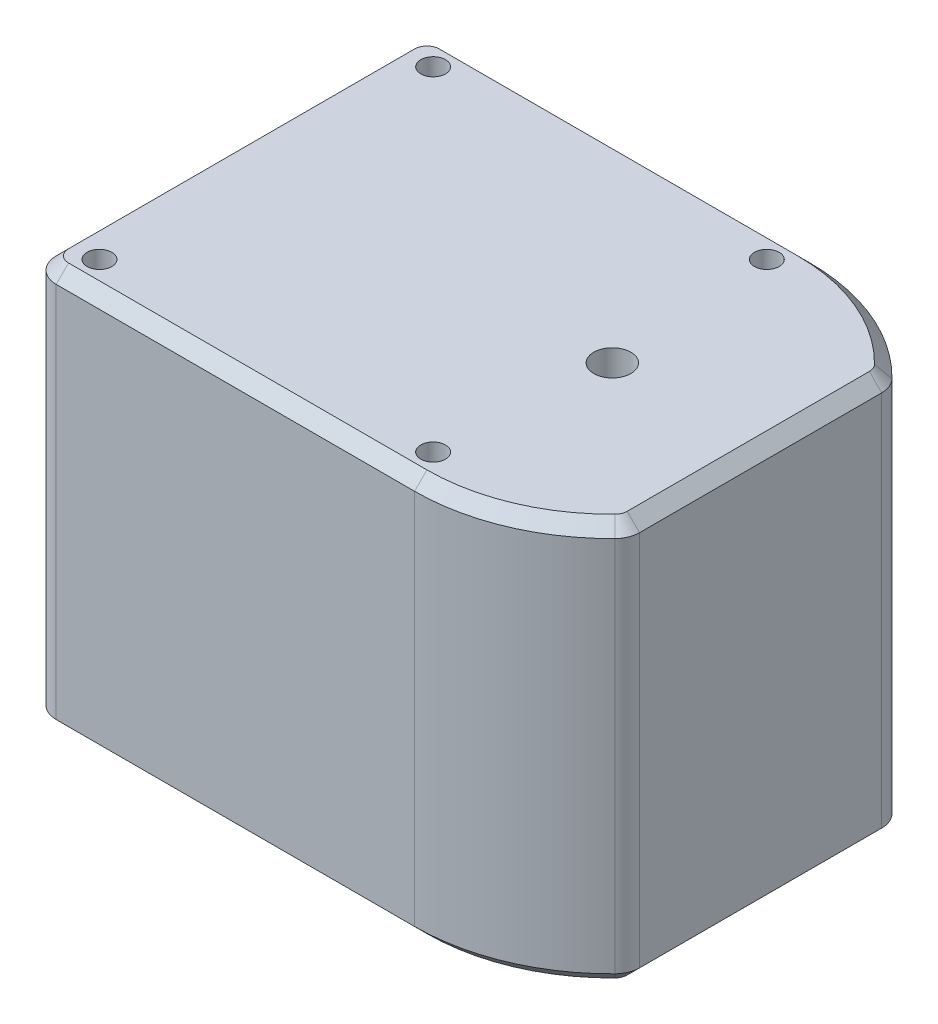
ISO-10303-21;
HEADER;
FILE_DESCRIPTION(('STEP AP214'),'2;1');
FILE_NAME('part.step','',(''),(''),'','','');
FILE_SCHEMA(('AUTOMOTIVE_DESIGN { 1 0 10303 214 1 1 1 1 }'));
ENDSEC;
DATA;
#1=APPLICATION_CONTEXT('core data for automotive mechanical design processes');
#2=APPLICATION_PROTOCOL_DEFINITION('international standard','automotive_design',2000,#1);
#3=PRODUCT_CONTEXT('',#1,'mechanical');
#4=PRODUCT('Part','Part','',(#3));
#5=PRODUCT_RELATED_PRODUCT_CATEGORY('part','',(#4));
#6=PRODUCT_DEFINITION_FORMATION('','',#4);
#7=PRODUCT_DEFINITION_CONTEXT('part definition',#1,'design');
#8=PRODUCT_DEFINITION('design','',#6,#7);
#9=PRODUCT_DEFINITION_SHAPE('','',#8);
#10=(LENGTH_UNIT() NAMED_UNIT(*) SI_UNIT(.MILLI.,.METRE.));
#11=(NAMED_UNIT(*) PLANE_ANGLE_UNIT() SI_UNIT($,.RADIAN.));
#12=(NAMED_UNIT(*) SI_UNIT($,.STERADIAN.) SOLID_ANGLE_UNIT());
#13=UNCERTAINTY_MEASURE_WITH_UNIT(LENGTH_MEASURE(1.E-05),#10,'distance_accuracy_value','');
#14=(GEOMETRIC_REPRESENTATION_CONTEXT(3) GLOBAL_UNCERTAINTY_ASSIGNED_CONTEXT((#13)) GLOBAL_UNIT_ASSIGNED_CONTEXT((#10,
#11,#12)) REPRESENTATION_CONTEXT('',''));
#15=CARTESIAN_POINT('',(0.,0.,0.));
#16=DIRECTION('',(0.,0.,1.));
#17=DIRECTION('',(1.,0.,0.));
#18=AXIS2_PLACEMENT_3D('',#15,#16,#17);
#19=CARTESIAN_POINT('',(0.,-16.25,-16.));
#20=DIRECTION('',(0.,0.,1.));
#21=DIRECTION('',(1.,0.,0.));
#22=AXIS2_PLACEMENT_3D('',#19,#20,#21);
#23=PLANE('',#22);
#24=DIRECTION('',(0.,1.,0.));
#25=VECTOR('',#24,1.);
#26=CARTESIAN_POINT('',(0.,-16.25,-16.));
#27=LINE('',#26,#25);
#28=CARTESIAN_POINT('',(0.,-15.25,-16.));
#29=VERTEX_POINT('',#28);
#30=CARTESIAN_POINT('',(0.,15.25,-16.));
#31=VERTEX_POINT('',#30);
#32=EDGE_CURVE('E269',#29,#31,#27,.T.);
#33=ORIENTED_EDGE('',*,*,#32,.F.);
#34=DIRECTION('',(-1.,0.,0.));
#35=VECTOR('',#34,1.);
#36=CARTESIAN_POINT('',(0.,-15.25,-16.));
#37=LINE('',#36,#35);
#38=CARTESIAN_POINT('',(-29.,-15.25,-16.));
#39=VERTEX_POINT('',#38);
#40=EDGE_CURVE('E328',#29,#39,#37,.T.);
#41=ORIENTED_EDGE('',*,*,#40,.T.);
#42=DIRECTION('',(0.,1.,0.));
#43=VECTOR('',#42,1.);
#44=CARTESIAN_POINT('',(-29.,-16.25,-16.));
#45=LINE('',#44,#43);
#46=CARTESIAN_POINT('',(-29.,15.25,-16.));
#47=VERTEX_POINT('',#46);
#48=EDGE_CURVE('E287',#39,#47,#45,.T.);
#49=ORIENTED_EDGE('',*,*,#48,.T.);
#50=DIRECTION('',(1.,0.,0.));
#51=VECTOR('',#50,1.);
#52=CARTESIAN_POINT('',(0.,15.25,-16.));
#53=LINE('',#52,#51);
#54=EDGE_CURVE('E326',#47,#31,#53,.T.);
#55=ORIENTED_EDGE('',*,*,#54,.T.);
#56=EDGE_LOOP('',(#33,#41,#49,#55));
#57=FACE_BOUND('',#56,.T.);
#58=DIRECTION('',(0.,-1.,0.));
#59=VECTOR('',#58,1.);
#60=CARTESIAN_POINT('',(-3.49999999999999,0.,-16.));
#61=LINE('',#60,#59);
#62=CARTESIAN_POINT('',(-3.49999999999999,-11.15,-16.));
#63=VERTEX_POINT('',#62);
#64=CARTESIAN_POINT('',(-3.49999999999999,-15.15,-16.));
#65=VERTEX_POINT('',#64);
#66=EDGE_CURVE('E209',#63,#65,#61,.T.);
#67=ORIENTED_EDGE('',*,*,#66,.F.);
#68=DIRECTION('',(1.,0.,0.));
#69=VECTOR('',#68,1.);
#70=CARTESIAN_POINT('',(0.,-11.15,-16.));
#71=LINE('',#70,#69);
#72=CARTESIAN_POINT('',(-12.,-11.15,-16.));
#73=VERTEX_POINT('',#72);
#74=EDGE_CURVE('E200',#73,#63,#71,.T.);
#75=ORIENTED_EDGE('',*,*,#74,.F.);
#76=DIRECTION('',(0.,-1.,0.));
#77=VECTOR('',#76,1.);
#78=CARTESIAN_POINT('',(-12.,0.,-16.));
#79=LINE('',#78,#77);
#80=CARTESIAN_POINT('',(-12.,-15.15,-16.));
#81=VERTEX_POINT('',#80);
#82=EDGE_CURVE('E52',#73,#81,#79,.T.);
#83=ORIENTED_EDGE('',*,*,#82,.T.);
#84=DIRECTION('',(1.,0.,0.));
#85=VECTOR('',#84,1.);
#86=CARTESIAN_POINT('',(0.,-15.15,-16.));
#87=LINE('',#86,#85);
#88=EDGE_CURVE('E216',#81,#65,#87,.T.);
#89=ORIENTED_EDGE('',*,*,#88,.T.);
#90=EDGE_LOOP('',(#67,#75,#83,#89));
#91=FACE_BOUND('',#90,.T.);
#92=ADVANCED_FACE('F35',(#57,#91),#23,.F.);
#93=CARTESIAN_POINT('',(0.,-16.25,0.));
#94=DIRECTION('',(0.,1.,0.));
#95=DIRECTION('',(0.,0.,1.));
#96=AXIS2_PLACEMENT_3D('',#93,#94,#95);
#97=CYLINDRICAL_SURFACE('',#96,16.);
#98=DIRECTION('',(0.,1.,0.));
#99=VECTOR('',#98,1.);
#100=CARTESIAN_POINT('',(11.4285714285714,-16.25,-11.1976673955802));
#101=LINE('',#100,#99);
#102=CARTESIAN_POINT('',(11.4285714285714,15.25,-11.1976673955802));
#103=VERTEX_POINT('',#102);
#104=CARTESIAN_POINT('',(11.4285714285714,-15.25,-11.1976673955802));
#105=VERTEX_POINT('',#104);
#106=EDGE_CURVE('E281',#103,#105,#101,.F.);
#107=ORIENTED_EDGE('',*,*,#106,.T.);
#108=CARTESIAN_POINT('',(0.,-15.25,0.));
#109=DIRECTION('',(0.,1.,0.));
#110=DIRECTION('',(0.,0.,1.));
#111=AXIS2_PLACEMENT_3D('',#108,#109,#110);
#112=CIRCLE('',#111,16.);
#113=EDGE_CURVE('E302',#105,#29,#112,.T.);
#114=ORIENTED_EDGE('',*,*,#113,.T.);
#115=ORIENTED_EDGE('',*,*,#32,.T.);
#116=CARTESIAN_POINT('',(0.,15.25,0.));
#117=DIRECTION('',(0.,1.,0.));
#118=DIRECTION('',(0.,0.,1.));
#119=AXIS2_PLACEMENT_3D('',#116,#117,#118);
#120=CIRCLE('',#119,16.);
#121=EDGE_CURVE('E299',#31,#103,#120,.F.);
#122=ORIENTED_EDGE('',*,*,#121,.T.);
#123=EDGE_LOOP('',(#107,#114,#115,#122));
#124=FACE_BOUND('',#123,.T.);
#125=ADVANCED_FACE('F507',(#124),#97,.T.);
#126=CARTESIAN_POINT('',(12.,-16.25,0.));
#127=DIRECTION('',(1.,0.,0.));
#128=DIRECTION('',(0.,0.,-1.));
#129=AXIS2_PLACEMENT_3D('',#126,#127,#128);
#130=PLANE('',#129);
#131=DIRECTION('',(0.,1.,0.));
#132=VECTOR('',#131,1.);
#133=CARTESIAN_POINT('',(12.,-16.25,9.79795897113271));
#134=LINE('',#133,#132);
#135=CARTESIAN_POINT('',(12.,15.25,9.79795897113271));
#136=VERTEX_POINT('',#135);
#137=CARTESIAN_POINT('',(12.,-15.25,9.79795897113271));
#138=VERTEX_POINT('',#137);
#139=EDGE_CURVE('E273',#136,#138,#134,.F.);
#140=ORIENTED_EDGE('',*,*,#139,.T.);
#141=DIRECTION('',(0.,0.,-1.));
#142=VECTOR('',#141,1.);
#143=CARTESIAN_POINT('',(12.,-15.25,-9.79795897113271));
#144=LINE('',#143,#142);
#145=CARTESIAN_POINT('',(12.,-15.25,-9.79795897113271));
#146=VERTEX_POINT('',#145);
#147=EDGE_CURVE('E340',#138,#146,#144,.T.);
#148=ORIENTED_EDGE('',*,*,#147,.T.);
#149=DIRECTION('',(0.,1.,0.));
#150=VECTOR('',#149,1.);
#151=CARTESIAN_POINT('',(12.,-16.25,-9.79795897113271));
#152=LINE('',#151,#150);
#153=CARTESIAN_POINT('',(12.,15.25,-9.79795897113271));
#154=VERTEX_POINT('',#153);
#155=EDGE_CURVE('E278',#146,#154,#152,.T.);
#156=ORIENTED_EDGE('',*,*,#155,.T.);
#157=DIRECTION('',(0.,0.,1.));
#158=VECTOR('',#157,1.);
#159=CARTESIAN_POINT('',(12.,15.25,0.));
#160=LINE('',#159,#158);
#161=EDGE_CURVE('E338',#154,#136,#160,.T.);
#162=ORIENTED_EDGE('',*,*,#161,.T.);
#163=EDGE_LOOP('',(#140,#148,#156,#162));
#164=FACE_BOUND('',#163,.T.);
#165=ADVANCED_FACE('F495',(#164),#130,.T.);
#166=DIRECTION('',(0.,1.,0.));
#167=VECTOR('',#166,1.);
#168=CARTESIAN_POINT('',(0.,-16.25,16.));
#169=LINE('',#168,#167);
#170=CARTESIAN_POINT('',(0.,-15.25,16.));
#171=VERTEX_POINT('',#170);
#172=CARTESIAN_POINT('',(0.,15.25,16.));
#173=VERTEX_POINT('',#172);
#174=EDGE_CURVE('E270',#171,#173,#169,.T.);
#175=ORIENTED_EDGE('',*,*,#174,.F.);
#176=CARTESIAN_POINT('',(0.,-15.25,0.));
#177=DIRECTION('',(0.,1.,0.));
#178=DIRECTION('',(0.,0.,1.));
#179=AXIS2_PLACEMENT_3D('',#176,#177,#178);
#180=CIRCLE('',#179,16.);
#181=CARTESIAN_POINT('',(11.4285714285714,-15.25,11.1976673955802));
#182=VERTEX_POINT('',#181);
#183=EDGE_CURVE('E356',#171,#182,#180,.T.);
#184=ORIENTED_EDGE('',*,*,#183,.T.);
#185=DIRECTION('',(0.,1.,0.));
#186=VECTOR('',#185,1.);
#187=CARTESIAN_POINT('',(11.4285714285714,-16.25,11.1976673955802));
#188=LINE('',#187,#186);
#189=CARTESIAN_POINT('',(11.4285714285714,15.25,11.1976673955802));
#190=VERTEX_POINT('',#189);
#191=EDGE_CURVE('E284',#182,#190,#188,.T.);
#192=ORIENTED_EDGE('',*,*,#191,.T.);
#193=CARTESIAN_POINT('',(0.,15.25,0.));
#194=DIRECTION('',(0.,1.,0.));
#195=DIRECTION('',(0.,0.,1.));
#196=AXIS2_PLACEMENT_3D('',#193,#194,#195);
#197=CIRCLE('',#196,16.);
#198=EDGE_CURVE('E354',#190,#173,#197,.F.);
#199=ORIENTED_EDGE('',*,*,#198,.T.);
#200=EDGE_LOOP('',(#175,#184,#192,#199));
#201=FACE_BOUND('',#200,.T.);
#202=ADVANCED_FACE('F473',(#201),#97,.T.);
#203=CARTESIAN_POINT('',(0.,-16.25,16.));
#204=DIRECTION('',(0.,0.,1.));
#205=DIRECTION('',(1.,0.,0.));
#206=AXIS2_PLACEMENT_3D('',#203,#204,#205);
#207=PLANE('',#206);
#208=DIRECTION('',(0.,1.,0.));
#209=VECTOR('',#208,1.);
#210=CARTESIAN_POINT('',(-29.,-16.25,16.));
#211=LINE('',#210,#209);
#212=CARTESIAN_POINT('',(-29.,15.25,16.));
#213=VERTEX_POINT('',#212);
#214=CARTESIAN_POINT('',(-29.,-15.25,16.));
#215=VERTEX_POINT('',#214);
#216=EDGE_CURVE('E296',#213,#215,#211,.F.);
#217=ORIENTED_EDGE('',*,*,#216,.T.);
#218=DIRECTION('',(1.,0.,0.));
#219=VECTOR('',#218,1.);
#220=CARTESIAN_POINT('',(0.,-15.25,16.));
#221=LINE('',#220,#219);
#222=EDGE_CURVE('E360',#215,#171,#221,.T.);
#223=ORIENTED_EDGE('',*,*,#222,.T.);
#224=ORIENTED_EDGE('',*,*,#174,.T.);
#225=DIRECTION('',(-1.,0.,0.));
#226=VECTOR('',#225,1.);
#227=CARTESIAN_POINT('',(0.,15.25,16.));
#228=LINE('',#227,#226);
#229=EDGE_CURVE('E358',#173,#213,#228,.T.);
#230=ORIENTED_EDGE('',*,*,#229,.T.);
#231=EDGE_LOOP('',(#217,#223,#224,#230));
#232=FACE_BOUND('',#231,.T.);
#233=ADVANCED_FACE('F444',(#232),#207,.T.);
#234=CARTESIAN_POINT('',(-31.,-16.25,0.));
#235=DIRECTION('',(1.,0.,0.));
#236=DIRECTION('',(0.,0.,-1.));
#237=AXIS2_PLACEMENT_3D('',#234,#235,#236);
#238=PLANE('',#237);
#239=DIRECTION('',(0.,1.,0.));
#240=VECTOR('',#239,1.);
#241=CARTESIAN_POINT('',(-31.,-16.25,-14.));
#242=LINE('',#241,#240);
#243=CARTESIAN_POINT('',(-31.,15.25,-14.));
#244=VERTEX_POINT('',#243);
#245=CARTESIAN_POINT('',(-31.,-15.25,-14.));
#246=VERTEX_POINT('',#245);
#247=EDGE_CURVE('E293',#244,#246,#242,.F.);
#248=ORIENTED_EDGE('',*,*,#247,.T.);
#249=DIRECTION('',(0.,0.,1.));
#250=VECTOR('',#249,1.);
#251=CARTESIAN_POINT('',(-31.,-15.25,0.));
#252=LINE('',#251,#250);
#253=CARTESIAN_POINT('',(-31.,-15.25,14.));
#254=VERTEX_POINT('',#253);
#255=EDGE_CURVE('E344',#246,#254,#252,.T.);
#256=ORIENTED_EDGE('',*,*,#255,.T.);
#257=DIRECTION('',(0.,1.,0.));
#258=VECTOR('',#257,1.);
#259=CARTESIAN_POINT('',(-31.,16.25,14.));
#260=LINE('',#259,#258);
#261=CARTESIAN_POINT('',(-31.,15.25,14.));
#262=VERTEX_POINT('',#261);
#263=EDGE_CURVE('E290',#254,#262,#260,.T.);
#264=ORIENTED_EDGE('',*,*,#263,.T.);
#265=DIRECTION('',(0.,0.,-1.));
#266=VECTOR('',#265,1.);
#267=CARTESIAN_POINT('',(-31.,15.25,-14.));
#268=LINE('',#267,#266);
#269=EDGE_CURVE('E342',#262,#244,#268,.T.);
#270=ORIENTED_EDGE('',*,*,#269,.T.);
#271=EDGE_LOOP('',(#248,#256,#264,#270));
#272=FACE_BOUND('',#271,.T.);
#273=ADVANCED_FACE('F548',(#272),#238,.F.);
#274=CARTESIAN_POINT('',(0.,-16.25,0.));
#275=DIRECTION('',(0.,1.,0.));
#276=DIRECTION('',(0.,0.,1.));
#277=AXIS2_PLACEMENT_3D('',#274,#275,#276);
#278=CYLINDRICAL_SURFACE('',#277,1.5);
#279=CARTESIAN_POINT('',(0.,-16.25,0.));
#280=DIRECTION('',(0.,1.,0.));
#281=DIRECTION('',(0.,0.,1.));
#282=AXIS2_PLACEMENT_3D('',#279,#280,#281);
#283=CIRCLE('',#282,1.5);
#284=CARTESIAN_POINT('',(0.,-16.25,1.5));
#285=VERTEX_POINT('',#284);
#286=EDGE_CURVE('E266',#285,#285,#283,.T.);
#287=ORIENTED_EDGE('',*,*,#286,.F.);
#288=EDGE_LOOP('',(#287));
#289=FACE_BOUND('',#288,.T.);
#290=CARTESIAN_POINT('',(0.,16.25,0.));
#291=DIRECTION('',(0.,1.,0.));
#292=DIRECTION('',(0.,0.,1.));
#293=AXIS2_PLACEMENT_3D('',#290,#291,#292);
#294=CIRCLE('',#293,1.5);
#295=CARTESIAN_POINT('',(0.,16.25,1.5));
#296=VERTEX_POINT('',#295);
#297=EDGE_CURVE('E263',#296,#296,#294,.T.);
#298=ORIENTED_EDGE('',*,*,#297,.T.);
#299=EDGE_LOOP('',(#298));
#300=FACE_BOUND('',#299,.T.);
#301=ADVANCED_FACE('F550',(#289,#300),#278,.F.);
#302=CARTESIAN_POINT('',(0.,-16.25,0.));
#303=DIRECTION('',(0.,1.,0.));
#304=DIRECTION('',(0.,0.,1.));
#305=AXIS2_PLACEMENT_3D('',#302,#303,#304);
#306=PLANE('',#305);
#307=DIRECTION('',(1.,0.,0.));
#308=VECTOR('',#307,1.);
#309=CARTESIAN_POINT('',(0.,-16.25,-15.));
#310=LINE('',#309,#308);
#311=CARTESIAN_POINT('',(-29.,-16.25,-15.));
#312=VERTEX_POINT('',#311);
#313=CARTESIAN_POINT('',(0.,-16.25,-15.));
#314=VERTEX_POINT('',#313);
#315=EDGE_CURVE('E321',#312,#314,#310,.T.);
#316=ORIENTED_EDGE('',*,*,#315,.T.);
#317=CARTESIAN_POINT('',(0.,-16.25,0.));
#318=DIRECTION('',(0.,1.,0.));
#319=DIRECTION('',(0.,0.,1.));
#320=AXIS2_PLACEMENT_3D('',#317,#318,#319);
#321=CIRCLE('',#320,15.);
#322=CARTESIAN_POINT('',(10.7142857142857,-16.25,-10.4978131833565));
#323=VERTEX_POINT('',#322);
#324=EDGE_CURVE('E323',#314,#323,#321,.F.);
#325=ORIENTED_EDGE('',*,*,#324,.T.);
#326=CARTESIAN_POINT('',(10.,-16.25,-9.79795897113271));
#327=DIRECTION('',(0.,1.,0.));
#328=DIRECTION('',(0.,0.,1.));
#329=AXIS2_PLACEMENT_3D('',#326,#327,#328);
#330=CIRCLE('',#329,0.999999999999992);
#331=CARTESIAN_POINT('',(11.,-16.25,-9.79795897113271));
#332=VERTEX_POINT('',#331);
#333=EDGE_CURVE('E319',#323,#332,#330,.F.);
#334=ORIENTED_EDGE('',*,*,#333,.T.);
#335=DIRECTION('',(0.,0.,1.));
#336=VECTOR('',#335,1.);
#337=CARTESIAN_POINT('',(11.,-16.25,9.79795897113271));
#338=LINE('',#337,#336);
#339=CARTESIAN_POINT('',(11.,-16.25,9.79795897113271));
#340=VERTEX_POINT('',#339);
#341=EDGE_CURVE('E315',#332,#340,#338,.T.);
#342=ORIENTED_EDGE('',*,*,#341,.T.);
#343=CARTESIAN_POINT('',(10.,-16.25,9.79795897113271));
#344=DIRECTION('',(0.,1.,0.));
#345=DIRECTION('',(0.,0.,1.));
#346=AXIS2_PLACEMENT_3D('',#343,#344,#345);
#347=CIRCLE('',#346,0.999999999999992);
#348=CARTESIAN_POINT('',(10.7142857142857,-16.25,10.4978131833565));
#349=VERTEX_POINT('',#348);
#350=EDGE_CURVE('E311',#340,#349,#347,.F.);
#351=ORIENTED_EDGE('',*,*,#350,.T.);
#352=CARTESIAN_POINT('',(0.,-16.25,0.));
#353=DIRECTION('',(0.,1.,0.));
#354=DIRECTION('',(0.,0.,1.));
#355=AXIS2_PLACEMENT_3D('',#352,#353,#354);
#356=CIRCLE('',#355,15.);
#357=CARTESIAN_POINT('',(0.,-16.25,15.));
#358=VERTEX_POINT('',#357);
#359=EDGE_CURVE('E307',#349,#358,#356,.F.);
#360=ORIENTED_EDGE('',*,*,#359,.T.);
#361=DIRECTION('',(-1.,0.,0.));
#362=VECTOR('',#361,1.);
#363=CARTESIAN_POINT('',(-29.,-16.25,15.));
#364=LINE('',#363,#362);
#365=CARTESIAN_POINT('',(-29.,-16.25,15.));
#366=VERTEX_POINT('',#365);
#367=EDGE_CURVE('E305',#358,#366,#364,.T.);
#368=ORIENTED_EDGE('',*,*,#367,.T.);
#369=CARTESIAN_POINT('',(-29.,-16.25,14.));
#370=DIRECTION('',(0.,1.,0.));
#371=DIRECTION('',(0.,0.,1.));
#372=AXIS2_PLACEMENT_3D('',#369,#370,#371);
#373=CIRCLE('',#372,0.999999999999994);
#374=CARTESIAN_POINT('',(-30.,-16.25,14.));
#375=VERTEX_POINT('',#374);
#376=EDGE_CURVE('E309',#366,#375,#373,.F.);
#377=ORIENTED_EDGE('',*,*,#376,.T.);
#378=DIRECTION('',(0.,0.,-1.));
#379=VECTOR('',#378,1.);
#380=CARTESIAN_POINT('',(-30.,-16.25,0.));
#381=LINE('',#380,#379);
#382=CARTESIAN_POINT('',(-30.,-16.25,-14.));
#383=VERTEX_POINT('',#382);
#384=EDGE_CURVE('E313',#375,#383,#381,.T.);
#385=ORIENTED_EDGE('',*,*,#384,.T.);
#386=CARTESIAN_POINT('',(-29.,-16.25,-14.));
#387=DIRECTION('',(0.,1.,0.));
#388=DIRECTION('',(0.,0.,1.));
#389=AXIS2_PLACEMENT_3D('',#386,#387,#388);
#390=CIRCLE('',#389,0.999999999999992);
#391=EDGE_CURVE('E317',#383,#312,#390,.F.);
#392=ORIENTED_EDGE('',*,*,#391,.T.);
#393=EDGE_LOOP('',(#316,#325,#334,#342,#351,#360,#368,#377,#385,#392));
#394=FACE_BOUND('',#393,.T.);
#395=CARTESIAN_POINT('',(-28.,-16.25,13.5));
#396=DIRECTION('',(0.,1.,0.));
#397=DIRECTION('',(0.,0.,1.));
#398=AXIS2_PLACEMENT_3D('',#395,#396,#397);
#399=CIRCLE('',#398,1.);
#400=CARTESIAN_POINT('',(-28.,-16.25,14.5));
#401=VERTEX_POINT('',#400);
#402=EDGE_CURVE('E249',#401,#401,#399,.T.);
#403=ORIENTED_EDGE('',*,*,#402,.T.);
#404=EDGE_LOOP('',(#403));
#405=FACE_BOUND('',#404,.T.);
#406=CARTESIAN_POINT('',(-0.999999999999999,-16.25,13.5));
#407=DIRECTION('',(0.,1.,0.));
#408=DIRECTION('',(0.,0.,1.));
#409=AXIS2_PLACEMENT_3D('',#406,#407,#408);
#410=CIRCLE('',#409,1.);
#411=CARTESIAN_POINT('',(-0.999999999999999,-16.25,14.5));
#412=VERTEX_POINT('',#411);
#413=EDGE_CURVE('E242',#412,#412,#410,.T.);
#414=ORIENTED_EDGE('',*,*,#413,.T.);
#415=EDGE_LOOP('',(#414));
#416=FACE_BOUND('',#415,.T.);
#417=CARTESIAN_POINT('',(-0.999999999999999,-16.25,-13.5));
#418=DIRECTION('',(0.,1.,0.));
#419=DIRECTION('',(0.,0.,1.));
#420=AXIS2_PLACEMENT_3D('',#417,#418,#419);
#421=CIRCLE('',#420,0.999999999999999);
#422=CARTESIAN_POINT('',(-0.999999999999999,-16.25,-12.5));
#423=VERTEX_POINT('',#422);
#424=EDGE_CURVE('E241',#423,#423,#421,.T.);
#425=ORIENTED_EDGE('',*,*,#424,.T.);
#426=EDGE_LOOP('',(#425));
#427=FACE_BOUND('',#426,.T.);
#428=CARTESIAN_POINT('',(-28.,-16.25,-13.5));
#429=DIRECTION('',(0.,1.,0.));
#430=DIRECTION('',(0.,0.,1.));
#431=AXIS2_PLACEMENT_3D('',#428,#429,#430);
#432=CIRCLE('',#431,1.);
#433=CARTESIAN_POINT('',(-28.,-16.25,-12.5));
#434=VERTEX_POINT('',#433);
#435=EDGE_CURVE('E260',#434,#434,#432,.T.);
#436=ORIENTED_EDGE('',*,*,#435,.T.);
#437=EDGE_LOOP('',(#436));
#438=FACE_BOUND('',#437,.T.);
#439=ORIENTED_EDGE('',*,*,#286,.T.);
#440=EDGE_LOOP('',(#439));
#441=FACE_BOUND('',#440,.T.);
#442=ADVANCED_FACE('F463',(#394,#405,#416,#427,#438,#441),#306,.F.);
#443=CARTESIAN_POINT('',(0.,16.25,0.));
#444=DIRECTION('',(0.,1.,0.));
#445=DIRECTION('',(0.,0.,1.));
#446=AXIS2_PLACEMENT_3D('',#443,#444,#445);
#447=PLANE('',#446);
#448=CARTESIAN_POINT('',(10.,16.25,-9.79795897113271));
#449=DIRECTION('',(0.,1.,0.));
#450=DIRECTION('',(0.,0.,1.));
#451=AXIS2_PLACEMENT_3D('',#448,#449,#450);
#452=CIRCLE('',#451,0.999999999999999);
#453=CARTESIAN_POINT('',(11.,16.25,-9.79795897113271));
#454=VERTEX_POINT('',#453);
#455=CARTESIAN_POINT('',(10.7142857142857,16.25,-10.4978131833565));
#456=VERTEX_POINT('',#455);
#457=EDGE_CURVE('E376',#454,#456,#452,.T.);
#458=ORIENTED_EDGE('',*,*,#457,.T.);
#459=CARTESIAN_POINT('',(0.,16.25,0.));
#460=DIRECTION('',(0.,1.,0.));
#461=DIRECTION('',(0.,0.,1.));
#462=AXIS2_PLACEMENT_3D('',#459,#460,#461);
#463=CIRCLE('',#462,15.);
#464=CARTESIAN_POINT('',(0.,16.25,-15.));
#465=VERTEX_POINT('',#464);
#466=EDGE_CURVE('E11',#456,#465,#463,.T.);
#467=ORIENTED_EDGE('',*,*,#466,.T.);
#468=DIRECTION('',(-1.,0.,0.));
#469=VECTOR('',#468,1.);
#470=CARTESIAN_POINT('',(-29.,16.25,-15.));
#471=LINE('',#470,#469);
#472=CARTESIAN_POINT('',(-29.,16.25,-15.));
#473=VERTEX_POINT('',#472);
#474=EDGE_CURVE('E44',#465,#473,#471,.T.);
#475=ORIENTED_EDGE('',*,*,#474,.T.);
#476=CARTESIAN_POINT('',(-29.,16.25,-14.));
#477=DIRECTION('',(0.,1.,0.));
#478=DIRECTION('',(0.,0.,1.));
#479=AXIS2_PLACEMENT_3D('',#476,#477,#478);
#480=CIRCLE('',#479,1.);
#481=CARTESIAN_POINT('',(-30.,16.25,-14.));
#482=VERTEX_POINT('',#481);
#483=EDGE_CURVE('E374',#473,#482,#480,.T.);
#484=ORIENTED_EDGE('',*,*,#483,.T.);
#485=DIRECTION('',(0.,0.,1.));
#486=VECTOR('',#485,1.);
#487=CARTESIAN_POINT('',(-30.,16.25,14.));
#488=LINE('',#487,#486);
#489=CARTESIAN_POINT('',(-30.,16.25,14.));
#490=VERTEX_POINT('',#489);
#491=EDGE_CURVE('E370',#482,#490,#488,.T.);
#492=ORIENTED_EDGE('',*,*,#491,.T.);
#493=CARTESIAN_POINT('',(-29.,16.25,14.));
#494=DIRECTION('',(0.,1.,0.));
#495=DIRECTION('',(0.,0.,1.));
#496=AXIS2_PLACEMENT_3D('',#493,#494,#495);
#497=CIRCLE('',#496,1.);
#498=CARTESIAN_POINT('',(-29.,16.25,15.));
#499=VERTEX_POINT('',#498);
#500=EDGE_CURVE('E366',#490,#499,#497,.T.);
#501=ORIENTED_EDGE('',*,*,#500,.T.);
#502=DIRECTION('',(1.,0.,0.));
#503=VECTOR('',#502,1.);
#504=CARTESIAN_POINT('',(0.,16.25,15.));
#505=LINE('',#504,#503);
#506=CARTESIAN_POINT('',(0.,16.25,15.));
#507=VERTEX_POINT('',#506);
#508=EDGE_CURVE('E362',#499,#507,#505,.T.);
#509=ORIENTED_EDGE('',*,*,#508,.T.);
#510=CARTESIAN_POINT('',(0.,16.25,0.));
#511=DIRECTION('',(0.,1.,0.));
#512=DIRECTION('',(0.,0.,1.));
#513=AXIS2_PLACEMENT_3D('',#510,#511,#512);
#514=CIRCLE('',#513,15.);
#515=CARTESIAN_POINT('',(10.7142857142857,16.25,10.4978131833565));
#516=VERTEX_POINT('',#515);
#517=EDGE_CURVE('E364',#507,#516,#514,.T.);
#518=ORIENTED_EDGE('',*,*,#517,.T.);
#519=CARTESIAN_POINT('',(10.,16.25,9.79795897113271));
#520=DIRECTION('',(0.,1.,0.));
#521=DIRECTION('',(0.,0.,1.));
#522=AXIS2_PLACEMENT_3D('',#519,#520,#521);
#523=CIRCLE('',#522,0.999999999999999);
#524=CARTESIAN_POINT('',(11.,16.25,9.79795897113271));
#525=VERTEX_POINT('',#524);
#526=EDGE_CURVE('E368',#516,#525,#523,.T.);
#527=ORIENTED_EDGE('',*,*,#526,.T.);
#528=DIRECTION('',(0.,0.,-1.));
#529=VECTOR('',#528,1.);
#530=CARTESIAN_POINT('',(11.,16.25,0.));
#531=LINE('',#530,#529);
#532=EDGE_CURVE('E372',#525,#454,#531,.T.);
#533=ORIENTED_EDGE('',*,*,#532,.T.);
#534=EDGE_LOOP('',(#458,#467,#475,#484,#492,#501,#509,#518,#527,#533));
#535=FACE_BOUND('',#534,.T.);
#536=CARTESIAN_POINT('',(-28.,16.25,13.5));
#537=DIRECTION('',(0.,1.,0.));
#538=DIRECTION('',(0.,0.,1.));
#539=AXIS2_PLACEMENT_3D('',#536,#537,#538);
#540=CIRCLE('',#539,1.);
#541=CARTESIAN_POINT('',(-28.,16.25,14.5));
#542=VERTEX_POINT('',#541);
#543=EDGE_CURVE('E252',#542,#542,#540,.T.);
#544=ORIENTED_EDGE('',*,*,#543,.F.);
#545=EDGE_LOOP('',(#544));
#546=FACE_BOUND('',#545,.T.);
#547=CARTESIAN_POINT('',(-0.999999999999999,16.25,13.5));
#548=DIRECTION('',(0.,1.,0.));
#549=DIRECTION('',(0.,0.,1.));
#550=AXIS2_PLACEMENT_3D('',#547,#548,#549);
#551=CIRCLE('',#550,1.);
#552=CARTESIAN_POINT('',(-0.999999999999999,16.25,14.5));
#553=VERTEX_POINT('',#552);
#554=EDGE_CURVE('E246',#553,#553,#551,.T.);
#555=ORIENTED_EDGE('',*,*,#554,.F.);
#556=EDGE_LOOP('',(#555));
#557=FACE_BOUND('',#556,.T.);
#558=CARTESIAN_POINT('',(-0.999999999999999,16.25,-13.5));
#559=DIRECTION('',(0.,1.,0.));
#560=DIRECTION('',(0.,0.,1.));
#561=AXIS2_PLACEMENT_3D('',#558,#559,#560);
#562=CIRCLE('',#561,0.999999999999999);
#563=CARTESIAN_POINT('',(-0.999999999999999,16.25,-12.5));
#564=VERTEX_POINT('',#563);
#565=EDGE_CURVE('E238',#564,#564,#562,.T.);
#566=ORIENTED_EDGE('',*,*,#565,.F.);
#567=EDGE_LOOP('',(#566));
#568=FACE_BOUND('',#567,.T.);
#569=CARTESIAN_POINT('',(-28.,16.25,-13.5));
#570=DIRECTION('',(0.,1.,0.));
#571=DIRECTION('',(0.,0.,1.));
#572=AXIS2_PLACEMENT_3D('',#569,#570,#571);
#573=CIRCLE('',#572,1.);
#574=CARTESIAN_POINT('',(-28.,16.25,-12.5));
#575=VERTEX_POINT('',#574);
#576=EDGE_CURVE('E245',#575,#575,#573,.T.);
#577=ORIENTED_EDGE('',*,*,#576,.F.);
#578=EDGE_LOOP('',(#577));
#579=FACE_BOUND('',#578,.T.);
#580=ORIENTED_EDGE('',*,*,#297,.F.);
#581=EDGE_LOOP('',(#580));
#582=FACE_BOUND('',#581,.T.);
#583=ADVANCED_FACE('F517',(#535,#546,#557,#568,#579,#582),#447,.T.);
#584=CARTESIAN_POINT('',(-28.,-16.25,-13.5));
#585=DIRECTION('',(0.,1.,0.));
#586=DIRECTION('',(0.,0.,1.));
#587=AXIS2_PLACEMENT_3D('',#584,#585,#586);
#588=CYLINDRICAL_SURFACE('',#587,1.);
#589=ORIENTED_EDGE('',*,*,#435,.F.);
#590=EDGE_LOOP('',(#589));
#591=FACE_BOUND('',#590,.T.);
#592=ORIENTED_EDGE('',*,*,#576,.T.);
#593=EDGE_LOOP('',(#592));
#594=FACE_BOUND('',#593,.T.);
#595=ADVANCED_FACE('F678',(#591,#594),#588,.F.);
#596=CARTESIAN_POINT('',(-0.999999999999999,-16.25,-13.5));
#597=DIRECTION('',(0.,1.,0.));
#598=DIRECTION('',(0.,0.,1.));
#599=AXIS2_PLACEMENT_3D('',#596,#597,#598);
#600=CYLINDRICAL_SURFACE('',#599,0.999999999999999);
#601=ORIENTED_EDGE('',*,*,#424,.F.);
#602=EDGE_LOOP('',(#601));
#603=FACE_BOUND('',#602,.T.);
#604=ORIENTED_EDGE('',*,*,#565,.T.);
#605=EDGE_LOOP('',(#604));
#606=FACE_BOUND('',#605,.T.);
#607=ADVANCED_FACE('F674',(#603,#606),#600,.F.);
#608=CARTESIAN_POINT('',(-0.999999999999999,-16.25,13.5));
#609=DIRECTION('',(0.,1.,0.));
#610=DIRECTION('',(0.,0.,1.));
#611=AXIS2_PLACEMENT_3D('',#608,#609,#610);
#612=CYLINDRICAL_SURFACE('',#611,1.);
#613=ORIENTED_EDGE('',*,*,#413,.F.);
#614=EDGE_LOOP('',(#613));
#615=FACE_BOUND('',#614,.T.);
#616=ORIENTED_EDGE('',*,*,#554,.T.);
#617=EDGE_LOOP('',(#616));
#618=FACE_BOUND('',#617,.T.);
#619=ADVANCED_FACE('F677',(#615,#618),#612,.F.);
#620=CARTESIAN_POINT('',(-28.,-16.25,13.5));
#621=DIRECTION('',(0.,1.,0.));
#622=DIRECTION('',(0.,0.,1.));
#623=AXIS2_PLACEMENT_3D('',#620,#621,#622);
#624=CYLINDRICAL_SURFACE('',#623,1.);
#625=ORIENTED_EDGE('',*,*,#402,.F.);
#626=EDGE_LOOP('',(#625));
#627=FACE_BOUND('',#626,.T.);
#628=ORIENTED_EDGE('',*,*,#543,.T.);
#629=EDGE_LOOP('',(#628));
#630=FACE_BOUND('',#629,.T.);
#631=ADVANCED_FACE('F556',(#627,#630),#624,.F.);
#632=CARTESIAN_POINT('',(10.,-16.25,-9.79795897113271));
#633=DIRECTION('',(0.,1.,0.));
#634=DIRECTION('',(0.,0.,1.));
#635=AXIS2_PLACEMENT_3D('',#632,#633,#634);
#636=CYLINDRICAL_SURFACE('',#635,2.);
#637=ORIENTED_EDGE('',*,*,#155,.F.);
#638=CARTESIAN_POINT('',(10.,-15.25,-9.79795897113271));
#639=DIRECTION('',(0.,1.,0.));
#640=DIRECTION('',(0.,0.,1.));
#641=AXIS2_PLACEMENT_3D('',#638,#639,#640);
#642=CIRCLE('',#641,2.);
#643=EDGE_CURVE('E332',#146,#105,#642,.T.);
#644=ORIENTED_EDGE('',*,*,#643,.T.);
#645=ORIENTED_EDGE('',*,*,#106,.F.);
#646=CARTESIAN_POINT('',(10.,15.25,-9.79795897113271));
#647=DIRECTION('',(0.,1.,0.));
#648=DIRECTION('',(0.,0.,1.));
#649=AXIS2_PLACEMENT_3D('',#646,#647,#648);
#650=CIRCLE('',#649,2.);
#651=EDGE_CURVE('E330',#103,#154,#650,.F.);
#652=ORIENTED_EDGE('',*,*,#651,.T.);
#653=EDGE_LOOP('',(#637,#644,#645,#652));
#654=FACE_BOUND('',#653,.T.);
#655=ADVANCED_FACE('F498',(#654),#636,.T.);
#656=CARTESIAN_POINT('',(10.,-16.25,9.79795897113271));
#657=DIRECTION('',(0.,1.,0.));
#658=DIRECTION('',(0.,0.,1.));
#659=AXIS2_PLACEMENT_3D('',#656,#657,#658);
#660=CYLINDRICAL_SURFACE('',#659,2.);
#661=ORIENTED_EDGE('',*,*,#191,.F.);
#662=CARTESIAN_POINT('',(10.,-15.25,9.79795897113271));
#663=DIRECTION('',(0.,1.,0.));
#664=DIRECTION('',(0.,0.,1.));
#665=AXIS2_PLACEMENT_3D('',#662,#663,#664);
#666=CIRCLE('',#665,2.);
#667=EDGE_CURVE('E348',#182,#138,#666,.T.);
#668=ORIENTED_EDGE('',*,*,#667,.T.);
#669=ORIENTED_EDGE('',*,*,#139,.F.);
#670=CARTESIAN_POINT('',(10.,15.25,9.79795897113271));
#671=DIRECTION('',(0.,1.,0.));
#672=DIRECTION('',(0.,0.,1.));
#673=AXIS2_PLACEMENT_3D('',#670,#671,#672);
#674=CIRCLE('',#673,2.);
#675=EDGE_CURVE('E346',#136,#190,#674,.F.);
#676=ORIENTED_EDGE('',*,*,#675,.T.);
#677=EDGE_LOOP('',(#661,#668,#669,#676));
#678=FACE_BOUND('',#677,.T.);
#679=ADVANCED_FACE('F477',(#678),#660,.T.);
#680=CARTESIAN_POINT('',(-29.,-16.25,-14.));
#681=DIRECTION('',(0.,1.,0.));
#682=DIRECTION('',(0.,0.,1.));
#683=AXIS2_PLACEMENT_3D('',#680,#681,#682);
#684=CYLINDRICAL_SURFACE('',#683,2.);
#685=ORIENTED_EDGE('',*,*,#48,.F.);
#686=CARTESIAN_POINT('',(-29.,-15.25,-14.));
#687=DIRECTION('',(0.,1.,0.));
#688=DIRECTION('',(0.,0.,1.));
#689=AXIS2_PLACEMENT_3D('',#686,#687,#688);
#690=CIRCLE('',#689,2.);
#691=EDGE_CURVE('E336',#39,#246,#690,.T.);
#692=ORIENTED_EDGE('',*,*,#691,.T.);
#693=ORIENTED_EDGE('',*,*,#247,.F.);
#694=CARTESIAN_POINT('',(-29.,15.25,-14.));
#695=DIRECTION('',(0.,1.,0.));
#696=DIRECTION('',(0.,0.,1.));
#697=AXIS2_PLACEMENT_3D('',#694,#695,#696);
#698=CIRCLE('',#697,2.);
#699=EDGE_CURVE('E334',#244,#47,#698,.F.);
#700=ORIENTED_EDGE('',*,*,#699,.T.);
#701=EDGE_LOOP('',(#685,#692,#693,#700));
#702=FACE_BOUND('',#701,.T.);
#703=ADVANCED_FACE('F559',(#702),#684,.T.);
#704=CARTESIAN_POINT('',(-29.,-16.25,14.));
#705=DIRECTION('',(0.,-1.,0.));
#706=DIRECTION('',(0.,0.,-1.));
#707=AXIS2_PLACEMENT_3D('',#704,#705,#706);
#708=CYLINDRICAL_SURFACE('',#707,2.);
#709=ORIENTED_EDGE('',*,*,#263,.F.);
#710=CARTESIAN_POINT('',(-29.,-15.25,14.));
#711=DIRECTION('',(0.,1.,0.));
#712=DIRECTION('',(0.,0.,1.));
#713=AXIS2_PLACEMENT_3D('',#710,#711,#712);
#714=CIRCLE('',#713,2.);
#715=EDGE_CURVE('E352',#254,#215,#714,.T.);
#716=ORIENTED_EDGE('',*,*,#715,.T.);
#717=ORIENTED_EDGE('',*,*,#216,.F.);
#718=CARTESIAN_POINT('',(-29.,15.25,14.));
#719=DIRECTION('',(0.,1.,0.));
#720=DIRECTION('',(0.,0.,1.));
#721=AXIS2_PLACEMENT_3D('',#718,#719,#720);
#722=CIRCLE('',#721,2.);
#723=EDGE_CURVE('E350',#213,#262,#722,.F.);
#724=ORIENTED_EDGE('',*,*,#723,.T.);
#725=EDGE_LOOP('',(#709,#716,#717,#724));
#726=FACE_BOUND('',#725,.T.);
#727=ADVANCED_FACE('F449',(#726),#708,.T.);
#728=CARTESIAN_POINT('',(0.,-15.25,16.));
#729=DIRECTION('',(0.,-0.70710678118655,0.707106781186545));
#730=DIRECTION('',(-1.,0.,0.));
#731=AXIS2_PLACEMENT_3D('',#728,#729,#730);
#732=PLANE('',#731);
#733=DIRECTION('',(0.,0.707106781186545,0.70710678118655));
#734=VECTOR('',#733,1.);
#735=CARTESIAN_POINT('',(-29.,-16.25,15.));
#736=LINE('',#735,#734);
#737=EDGE_CURVE('E401',#366,#215,#736,.T.);
#738=ORIENTED_EDGE('',*,*,#737,.F.);
#739=ORIENTED_EDGE('',*,*,#367,.F.);
#740=DIRECTION('',(0.,-0.707106781186545,-0.70710678118655));
#741=VECTOR('',#740,1.);
#742=CARTESIAN_POINT('',(0.,-15.25,16.));
#743=LINE('',#742,#741);
#744=EDGE_CURVE('E255',#171,#358,#743,.T.);
#745=ORIENTED_EDGE('',*,*,#744,.F.);
#746=ORIENTED_EDGE('',*,*,#222,.F.);
#747=EDGE_LOOP('',(#738,#739,#745,#746));
#748=FACE_BOUND('',#747,.T.);
#749=ADVANCED_FACE('F470',(#748),#732,.T.);
#750=CARTESIAN_POINT('',(0.,-15.25,0.));
#751=DIRECTION('',(0.,1.,0.));
#752=DIRECTION('',(0.,0.,1.));
#753=AXIS2_PLACEMENT_3D('',#750,#751,#752);
#754=CONICAL_SURFACE('',#753,16.,0.785398163397452);
#755=ORIENTED_EDGE('',*,*,#744,.T.);
#756=ORIENTED_EDGE('',*,*,#359,.F.);
#757=DIRECTION('',(-0.505076272276108,-0.707106781186545,-0.494871659305394));
#758=VECTOR('',#757,1.);
#759=CARTESIAN_POINT('',(11.4285714285714,-15.25,11.1976673955802));
#760=LINE('',#759,#758);
#761=EDGE_CURVE('E398',#182,#349,#760,.T.);
#762=ORIENTED_EDGE('',*,*,#761,.F.);
#763=ORIENTED_EDGE('',*,*,#183,.F.);
#764=EDGE_LOOP('',(#755,#756,#762,#763));
#765=FACE_BOUND('',#764,.T.);
#766=ADVANCED_FACE('F482',(#765),#754,.T.);
#767=CARTESIAN_POINT('',(-29.,-16.25,14.));
#768=DIRECTION('',(0.,1.,0.));
#769=DIRECTION('',(0.,0.,1.));
#770=AXIS2_PLACEMENT_3D('',#767,#768,#769);
#771=CONICAL_SURFACE('',#770,0.999999999999994,0.785398163397451);
#772=ORIENTED_EDGE('',*,*,#737,.T.);
#773=ORIENTED_EDGE('',*,*,#715,.F.);
#774=DIRECTION('',(-0.70710678118655,0.707106781186545,0.));
#775=VECTOR('',#774,1.);
#776=CARTESIAN_POINT('',(-30.,-16.25,14.));
#777=LINE('',#776,#775);
#778=EDGE_CURVE('E395',#375,#254,#777,.T.);
#779=ORIENTED_EDGE('',*,*,#778,.F.);
#780=ORIENTED_EDGE('',*,*,#376,.F.);
#781=EDGE_LOOP('',(#772,#773,#779,#780));
#782=FACE_BOUND('',#781,.T.);
#783=ADVANCED_FACE('F453',(#782),#771,.T.);
#784=CARTESIAN_POINT('',(10.,-16.25,9.79795897113271));
#785=DIRECTION('',(0.,1.,0.));
#786=DIRECTION('',(0.,0.,1.));
#787=AXIS2_PLACEMENT_3D('',#784,#785,#786);
#788=CONICAL_SURFACE('',#787,0.999999999999992,0.785398163397452);
#789=ORIENTED_EDGE('',*,*,#761,.T.);
#790=ORIENTED_EDGE('',*,*,#350,.F.);
#791=DIRECTION('',(-0.70710678118655,-0.707106781186545,0.));
#792=VECTOR('',#791,1.);
#793=CARTESIAN_POINT('',(12.,-15.25,9.79795897113271));
#794=LINE('',#793,#792);
#795=EDGE_CURVE('E392',#138,#340,#794,.T.);
#796=ORIENTED_EDGE('',*,*,#795,.F.);
#797=ORIENTED_EDGE('',*,*,#667,.F.);
#798=EDGE_LOOP('',(#789,#790,#796,#797));
#799=FACE_BOUND('',#798,.T.);
#800=ADVANCED_FACE('F486',(#799),#788,.T.);
#801=CARTESIAN_POINT('',(-30.,-16.25,0.));
#802=DIRECTION('',(0.707106781186545,0.70710678118655,0.));
#803=DIRECTION('',(0.,0.,-1.));
#804=AXIS2_PLACEMENT_3D('',#801,#802,#803);
#805=PLANE('',#804);
#806=ORIENTED_EDGE('',*,*,#778,.T.);
#807=ORIENTED_EDGE('',*,*,#255,.F.);
#808=DIRECTION('',(-0.70710678118655,0.707106781186545,0.));
#809=VECTOR('',#808,1.);
#810=CARTESIAN_POINT('',(-30.,-16.25,-14.));
#811=LINE('',#810,#809);
#812=EDGE_CURVE('E389',#383,#246,#811,.T.);
#813=ORIENTED_EDGE('',*,*,#812,.F.);
#814=ORIENTED_EDGE('',*,*,#384,.F.);
#815=EDGE_LOOP('',(#806,#807,#813,#814));
#816=FACE_BOUND('',#815,.T.);
#817=ADVANCED_FACE('F459',(#816),#805,.F.);
#818=CARTESIAN_POINT('',(12.,-15.25,0.));
#819=DIRECTION('',(0.707106781186545,-0.70710678118655,0.));
#820=DIRECTION('',(0.,0.,1.));
#821=AXIS2_PLACEMENT_3D('',#818,#819,#820);
#822=PLANE('',#821);
#823=ORIENTED_EDGE('',*,*,#795,.T.);
#824=ORIENTED_EDGE('',*,*,#341,.F.);
#825=DIRECTION('',(-0.70710678118655,-0.707106781186545,0.));
#826=VECTOR('',#825,1.);
#827=CARTESIAN_POINT('',(12.,-15.25,-9.79795897113271));
#828=LINE('',#827,#826);
#829=EDGE_CURVE('E386',#146,#332,#828,.T.);
#830=ORIENTED_EDGE('',*,*,#829,.F.);
#831=ORIENTED_EDGE('',*,*,#147,.F.);
#832=EDGE_LOOP('',(#823,#824,#830,#831));
#833=FACE_BOUND('',#832,.T.);
#834=ADVANCED_FACE('F491',(#833),#822,.T.);
#835=CARTESIAN_POINT('',(-29.,-16.25,-14.));
#836=DIRECTION('',(0.,1.,0.));
#837=DIRECTION('',(0.,0.,1.));
#838=AXIS2_PLACEMENT_3D('',#835,#836,#837);
#839=CONICAL_SURFACE('',#838,0.999999999999992,0.785398163397452);
#840=ORIENTED_EDGE('',*,*,#812,.T.);
#841=ORIENTED_EDGE('',*,*,#691,.F.);
#842=DIRECTION('',(0.,0.707106781186546,-0.707106781186549));
#843=VECTOR('',#842,1.);
#844=CARTESIAN_POINT('',(-29.,-16.25,-15.));
#845=LINE('',#844,#843);
#846=EDGE_CURVE('E383',#312,#39,#845,.T.);
#847=ORIENTED_EDGE('',*,*,#846,.F.);
#848=ORIENTED_EDGE('',*,*,#391,.F.);
#849=EDGE_LOOP('',(#840,#841,#847,#848));
#850=FACE_BOUND('',#849,.T.);
#851=ADVANCED_FACE('F576',(#850),#839,.T.);
#852=CARTESIAN_POINT('',(10.,-16.25,-9.79795897113271));
#853=DIRECTION('',(0.,1.,0.));
#854=DIRECTION('',(0.,0.,1.));
#855=AXIS2_PLACEMENT_3D('',#852,#853,#854);
#856=CONICAL_SURFACE('',#855,0.999999999999992,0.785398163397452);
#857=ORIENTED_EDGE('',*,*,#829,.T.);
#858=ORIENTED_EDGE('',*,*,#333,.F.);
#859=DIRECTION('',(-0.505076272276107,-0.707106781186545,0.494871659305395));
#860=VECTOR('',#859,1.);
#861=CARTESIAN_POINT('',(11.4285714285714,-15.25,-11.1976673955802));
#862=LINE('',#861,#860);
#863=EDGE_CURVE('E381',#105,#323,#862,.T.);
#864=ORIENTED_EDGE('',*,*,#863,.F.);
#865=ORIENTED_EDGE('',*,*,#643,.F.);
#866=EDGE_LOOP('',(#857,#858,#864,#865));
#867=FACE_BOUND('',#866,.T.);
#868=ADVANCED_FACE('F572',(#867),#856,.T.);
#869=CARTESIAN_POINT('',(0.,-16.25,-15.));
#870=DIRECTION('',(0.,0.70710678118655,0.707106781186545));
#871=DIRECTION('',(1.,0.,0.));
#872=AXIS2_PLACEMENT_3D('',#869,#870,#871);
#873=PLANE('',#872);
#874=ORIENTED_EDGE('',*,*,#846,.T.);
#875=ORIENTED_EDGE('',*,*,#40,.F.);
#876=DIRECTION('',(0.,0.707106781186545,-0.70710678118655));
#877=VECTOR('',#876,1.);
#878=CARTESIAN_POINT('',(0.,-16.25,-15.));
#879=LINE('',#878,#877);
#880=EDGE_CURVE('E379',#314,#29,#879,.T.);
#881=ORIENTED_EDGE('',*,*,#880,.F.);
#882=ORIENTED_EDGE('',*,*,#315,.F.);
#883=EDGE_LOOP('',(#874,#875,#881,#882));
#884=FACE_BOUND('',#883,.T.);
#885=ADVANCED_FACE('F568',(#884),#873,.F.);
#886=CARTESIAN_POINT('',(0.,-15.25,0.));
#887=DIRECTION('',(0.,1.,0.));
#888=DIRECTION('',(0.,0.,1.));
#889=AXIS2_PLACEMENT_3D('',#886,#887,#888);
#890=CONICAL_SURFACE('',#889,16.,0.785398163397452);
#891=ORIENTED_EDGE('',*,*,#863,.T.);
#892=ORIENTED_EDGE('',*,*,#324,.F.);
#893=ORIENTED_EDGE('',*,*,#880,.T.);
#894=ORIENTED_EDGE('',*,*,#113,.F.);
#895=EDGE_LOOP('',(#891,#892,#893,#894));
#896=FACE_BOUND('',#895,.T.);
#897=ADVANCED_FACE('F565',(#896),#890,.T.);
#898=CARTESIAN_POINT('',(0.,16.25,15.));
#899=DIRECTION('',(0.,-0.707106781186545,-0.70710678118655));
#900=DIRECTION('',(1.,0.,0.));
#901=AXIS2_PLACEMENT_3D('',#898,#899,#900);
#902=PLANE('',#901);
#903=DIRECTION('',(0.,0.70710678118655,-0.707106781186545));
#904=VECTOR('',#903,1.);
#905=CARTESIAN_POINT('',(-29.,15.25,16.));
#906=LINE('',#905,#904);
#907=EDGE_CURVE('E426',#213,#499,#906,.T.);
#908=ORIENTED_EDGE('',*,*,#907,.F.);
#909=ORIENTED_EDGE('',*,*,#229,.F.);
#910=DIRECTION('',(0.,-0.70710678118655,0.707106781186545));
#911=VECTOR('',#910,1.);
#912=CARTESIAN_POINT('',(0.,16.25,15.));
#913=LINE('',#912,#911);
#914=EDGE_CURVE('E39',#507,#173,#913,.T.);
#915=ORIENTED_EDGE('',*,*,#914,.F.);
#916=ORIENTED_EDGE('',*,*,#508,.F.);
#917=EDGE_LOOP('',(#908,#909,#915,#916));
#918=FACE_BOUND('',#917,.T.);
#919=ADVANCED_FACE('F37',(#918),#902,.F.);
#920=CARTESIAN_POINT('',(0.,16.25,0.));
#921=DIRECTION('',(0.,-1.,0.));
#922=DIRECTION('',(0.,0.,-1.));
#923=AXIS2_PLACEMENT_3D('',#920,#921,#922);
#924=CONICAL_SURFACE('',#923,15.,0.785398163397445);
#925=ORIENTED_EDGE('',*,*,#914,.T.);
#926=ORIENTED_EDGE('',*,*,#198,.F.);
#927=DIRECTION('',(0.505076272276104,-0.707106781186551,0.494871659305391));
#928=VECTOR('',#927,1.);
#929=CARTESIAN_POINT('',(10.7142857142857,16.25,10.4978131833565));
#930=LINE('',#929,#928);
#931=EDGE_CURVE('E424',#516,#190,#930,.T.);
#932=ORIENTED_EDGE('',*,*,#931,.F.);
#933=ORIENTED_EDGE('',*,*,#517,.F.);
#934=EDGE_LOOP('',(#925,#926,#932,#933));
#935=FACE_BOUND('',#934,.T.);
#936=ADVANCED_FACE('F437',(#935),#924,.T.);
#937=CARTESIAN_POINT('',(-29.,16.25,14.));
#938=DIRECTION('',(0.,-1.,0.));
#939=DIRECTION('',(0.,0.,-1.));
#940=AXIS2_PLACEMENT_3D('',#937,#938,#939);
#941=CONICAL_SURFACE('',#940,1.,0.785398163397444);
#942=ORIENTED_EDGE('',*,*,#907,.T.);
#943=ORIENTED_EDGE('',*,*,#500,.F.);
#944=DIRECTION('',(0.707106781186545,0.70710678118655,0.));
#945=VECTOR('',#944,1.);
#946=CARTESIAN_POINT('',(-31.,15.25,14.));
#947=LINE('',#946,#945);
#948=EDGE_CURVE('E421',#262,#490,#947,.T.);
#949=ORIENTED_EDGE('',*,*,#948,.F.);
#950=ORIENTED_EDGE('',*,*,#723,.F.);
#951=EDGE_LOOP('',(#942,#943,#949,#950));
#952=FACE_BOUND('',#951,.T.);
#953=ADVANCED_FACE('F528',(#952),#941,.T.);
#954=CARTESIAN_POINT('',(10.,16.25,9.79795897113271));
#955=DIRECTION('',(0.,-1.,0.));
#956=DIRECTION('',(0.,0.,-1.));
#957=AXIS2_PLACEMENT_3D('',#954,#955,#956);
#958=CONICAL_SURFACE('',#957,0.999999999999999,0.785398163397445);
#959=ORIENTED_EDGE('',*,*,#931,.T.);
#960=ORIENTED_EDGE('',*,*,#675,.F.);
#961=DIRECTION('',(0.707106781186545,-0.70710678118655,0.));
#962=VECTOR('',#961,1.);
#963=CARTESIAN_POINT('',(11.,16.25,9.79795897113271));
#964=LINE('',#963,#962);
#965=EDGE_CURVE('E418',#525,#136,#964,.T.);
#966=ORIENTED_EDGE('',*,*,#965,.F.);
#967=ORIENTED_EDGE('',*,*,#526,.F.);
#968=EDGE_LOOP('',(#959,#960,#966,#967));
#969=FACE_BOUND('',#968,.T.);
#970=ADVANCED_FACE('F525',(#969),#958,.T.);
#971=CARTESIAN_POINT('',(-31.,15.25,0.));
#972=DIRECTION('',(-0.70710678118655,0.707106781186545,0.));
#973=DIRECTION('',(0.,0.,1.));
#974=AXIS2_PLACEMENT_3D('',#971,#972,#973);
#975=PLANE('',#974);
#976=ORIENTED_EDGE('',*,*,#948,.T.);
#977=ORIENTED_EDGE('',*,*,#491,.F.);
#978=DIRECTION('',(0.707106781186545,0.70710678118655,0.));
#979=VECTOR('',#978,1.);
#980=CARTESIAN_POINT('',(-31.,15.25,-14.));
#981=LINE('',#980,#979);
#982=EDGE_CURVE('E415',#244,#482,#981,.T.);
#983=ORIENTED_EDGE('',*,*,#982,.F.);
#984=ORIENTED_EDGE('',*,*,#269,.F.);
#985=EDGE_LOOP('',(#976,#977,#983,#984));
#986=FACE_BOUND('',#985,.T.);
#987=ADVANCED_FACE('F527',(#986),#975,.T.);
#988=CARTESIAN_POINT('',(11.,16.25,0.));
#989=DIRECTION('',(-0.70710678118655,-0.707106781186545,0.));
#990=DIRECTION('',(0.,0.,-1.));
#991=AXIS2_PLACEMENT_3D('',#988,#989,#990);
#992=PLANE('',#991);
#993=ORIENTED_EDGE('',*,*,#965,.T.);
#994=ORIENTED_EDGE('',*,*,#161,.F.);
#995=DIRECTION('',(0.707106781186545,-0.70710678118655,0.));
#996=VECTOR('',#995,1.);
#997=CARTESIAN_POINT('',(11.,16.25,-9.79795897113271));
#998=LINE('',#997,#996);
#999=EDGE_CURVE('E412',#454,#154,#998,.T.);
#1000=ORIENTED_EDGE('',*,*,#999,.F.);
#1001=ORIENTED_EDGE('',*,*,#532,.F.);
#1002=EDGE_LOOP('',(#993,#994,#1000,#1001));
#1003=FACE_BOUND('',#1002,.T.);
#1004=ADVANCED_FACE('F523',(#1003),#992,.F.);
#1005=CARTESIAN_POINT('',(-29.,16.25,-14.));
#1006=DIRECTION('',(0.,-1.,0.));
#1007=DIRECTION('',(0.,0.,-1.));
#1008=AXIS2_PLACEMENT_3D('',#1005,#1006,#1007);
#1009=CONICAL_SURFACE('',#1008,0.999999999999999,0.785398163397445);
#1010=ORIENTED_EDGE('',*,*,#982,.T.);
#1011=ORIENTED_EDGE('',*,*,#483,.F.);
#1012=DIRECTION('',(0.,0.707106781186551,0.707106781186544));
#1013=VECTOR('',#1012,1.);
#1014=CARTESIAN_POINT('',(-29.,15.25,-16.));
#1015=LINE('',#1014,#1013);
#1016=EDGE_CURVE('E409',#47,#473,#1015,.T.);
#1017=ORIENTED_EDGE('',*,*,#1016,.F.);
#1018=ORIENTED_EDGE('',*,*,#699,.F.);
#1019=EDGE_LOOP('',(#1010,#1011,#1017,#1018));
#1020=FACE_BOUND('',#1019,.T.);
#1021=ADVANCED_FACE('F599',(#1020),#1009,.T.);
#1022=CARTESIAN_POINT('',(10.,16.25,-9.79795897113271));
#1023=DIRECTION('',(0.,-1.,0.));
#1024=DIRECTION('',(0.,0.,-1.));
#1025=AXIS2_PLACEMENT_3D('',#1022,#1023,#1024);
#1026=CONICAL_SURFACE('',#1025,0.999999999999999,0.785398163397445);
#1027=ORIENTED_EDGE('',*,*,#999,.T.);
#1028=ORIENTED_EDGE('',*,*,#651,.F.);
#1029=DIRECTION('',(0.505076272276104,-0.707106781186551,-0.494871659305391));
#1030=VECTOR('',#1029,1.);
#1031=CARTESIAN_POINT('',(10.7142857142857,16.25,-10.4978131833565));
#1032=LINE('',#1031,#1030);
#1033=EDGE_CURVE('E407',#456,#103,#1032,.T.);
#1034=ORIENTED_EDGE('',*,*,#1033,.F.);
#1035=ORIENTED_EDGE('',*,*,#457,.F.);
#1036=EDGE_LOOP('',(#1027,#1028,#1034,#1035));
#1037=FACE_BOUND('',#1036,.T.);
#1038=ADVANCED_FACE('F503',(#1037),#1026,.T.);
#1039=CARTESIAN_POINT('',(0.,15.25,-16.));
#1040=DIRECTION('',(0.,0.707106781186545,-0.70710678118655));
#1041=DIRECTION('',(-1.,0.,0.));
#1042=AXIS2_PLACEMENT_3D('',#1039,#1040,#1041);
#1043=PLANE('',#1042);
#1044=ORIENTED_EDGE('',*,*,#1016,.T.);
#1045=ORIENTED_EDGE('',*,*,#474,.F.);
#1046=DIRECTION('',(0.,0.70710678118655,0.707106781186545));
#1047=VECTOR('',#1046,1.);
#1048=CARTESIAN_POINT('',(0.,15.25,-16.));
#1049=LINE('',#1048,#1047);
#1050=EDGE_CURVE('E60',#31,#465,#1049,.T.);
#1051=ORIENTED_EDGE('',*,*,#1050,.F.);
#1052=ORIENTED_EDGE('',*,*,#54,.F.);
#1053=EDGE_LOOP('',(#1044,#1045,#1051,#1052));
#1054=FACE_BOUND('',#1053,.T.);
#1055=ADVANCED_FACE('F513',(#1054),#1043,.T.);
#1056=CARTESIAN_POINT('',(0.,16.25,0.));
#1057=DIRECTION('',(0.,-1.,0.));
#1058=DIRECTION('',(0.,0.,-1.));
#1059=AXIS2_PLACEMENT_3D('',#1056,#1057,#1058);
#1060=CONICAL_SURFACE('',#1059,15.,0.785398163397445);
#1061=ORIENTED_EDGE('',*,*,#1033,.T.);
#1062=ORIENTED_EDGE('',*,*,#121,.F.);
#1063=ORIENTED_EDGE('',*,*,#1050,.T.);
#1064=ORIENTED_EDGE('',*,*,#466,.F.);
#1065=EDGE_LOOP('',(#1061,#1062,#1063,#1064));
#1066=FACE_BOUND('',#1065,.T.);
#1067=ADVANCED_FACE('F510',(#1066),#1060,.T.);
#1068=CARTESIAN_POINT('',(-3.49999999999999,0.,-16.));
#1069=DIRECTION('',(-1.,0.,0.));
#1070=DIRECTION('',(0.,0.,1.));
#1071=AXIS2_PLACEMENT_3D('',#1068,#1069,#1070);
#1072=PLANE('',#1071);
#1073=DIRECTION('',(0.,-1.,0.));
#1074=VECTOR('',#1073,1.);
#1075=CARTESIAN_POINT('',(-3.49999999999999,0.,0.));
#1076=LINE('',#1075,#1074);
#1077=CARTESIAN_POINT('',(-3.49999999999999,-11.15,0.));
#1078=VERTEX_POINT('',#1077);
#1079=CARTESIAN_POINT('',(-3.49999999999999,-15.15,0.));
#1080=VERTEX_POINT('',#1079);
#1081=EDGE_CURVE('E215',#1078,#1080,#1076,.T.);
#1082=ORIENTED_EDGE('',*,*,#1081,.F.);
#1083=DIRECTION('',(0.,0.,1.));
#1084=VECTOR('',#1083,1.);
#1085=CARTESIAN_POINT('',(-3.49999999999999,-11.15,-16.));
#1086=LINE('',#1085,#1084);
#1087=EDGE_CURVE('E204',#63,#1078,#1086,.T.);
#1088=ORIENTED_EDGE('',*,*,#1087,.F.);
#1089=ORIENTED_EDGE('',*,*,#66,.T.);
#1090=DIRECTION('',(0.,0.,1.));
#1091=VECTOR('',#1090,1.);
#1092=CARTESIAN_POINT('',(-3.49999999999999,-15.15,-16.));
#1093=LINE('',#1092,#1091);
#1094=EDGE_CURVE('E233',#65,#1080,#1093,.T.);
#1095=ORIENTED_EDGE('',*,*,#1094,.T.);
#1096=EDGE_LOOP('',(#1082,#1088,#1089,#1095));
#1097=FACE_BOUND('',#1096,.T.);
#1098=ADVANCED_FACE('F212',(#1097),#1072,.T.);
#1099=CARTESIAN_POINT('',(0.,-15.15,-16.));
#1100=DIRECTION('',(0.,-1.,0.));
#1101=DIRECTION('',(0.,0.,-1.));
#1102=AXIS2_PLACEMENT_3D('',#1099,#1100,#1101);
#1103=PLANE('',#1102);
#1104=DIRECTION('',(1.,0.,0.));
#1105=VECTOR('',#1104,1.);
#1106=CARTESIAN_POINT('',(0.,-15.15,0.));
#1107=LINE('',#1106,#1105);
#1108=CARTESIAN_POINT('',(-12.,-15.15,0.));
#1109=VERTEX_POINT('',#1108);
#1110=EDGE_CURVE('E220',#1109,#1080,#1107,.T.);
#1111=ORIENTED_EDGE('',*,*,#1110,.T.);
#1112=ORIENTED_EDGE('',*,*,#1094,.F.);
#1113=ORIENTED_EDGE('',*,*,#88,.F.);
#1114=DIRECTION('',(0.,0.,1.));
#1115=VECTOR('',#1114,1.);
#1116=CARTESIAN_POINT('',(-12.,-15.15,-16.));
#1117=LINE('',#1116,#1115);
#1118=EDGE_CURVE('E235',#81,#1109,#1117,.T.);
#1119=ORIENTED_EDGE('',*,*,#1118,.T.);
#1120=EDGE_LOOP('',(#1111,#1112,#1113,#1119));
#1121=FACE_BOUND('',#1120,.T.);
#1122=ADVANCED_FACE('F633',(#1121),#1103,.F.);
#1123=CARTESIAN_POINT('',(-12.,0.,-16.));
#1124=DIRECTION('',(-1.,0.,0.));
#1125=DIRECTION('',(0.,0.,1.));
#1126=AXIS2_PLACEMENT_3D('',#1123,#1124,#1125);
#1127=PLANE('',#1126);
#1128=DIRECTION('',(0.,-1.,0.));
#1129=VECTOR('',#1128,1.);
#1130=CARTESIAN_POINT('',(-12.,0.,0.));
#1131=LINE('',#1130,#1129);
#1132=CARTESIAN_POINT('',(-12.,-11.15,0.));
#1133=VERTEX_POINT('',#1132);
#1134=EDGE_CURVE('E223',#1133,#1109,#1131,.T.);
#1135=ORIENTED_EDGE('',*,*,#1134,.T.);
#1136=ORIENTED_EDGE('',*,*,#1118,.F.);
#1137=ORIENTED_EDGE('',*,*,#82,.F.);
#1138=DIRECTION('',(0.,0.,1.));
#1139=VECTOR('',#1138,1.);
#1140=CARTESIAN_POINT('',(-12.,-11.15,-16.));
#1141=LINE('',#1140,#1139);
#1142=EDGE_CURVE('E206',#73,#1133,#1141,.T.);
#1143=ORIENTED_EDGE('',*,*,#1142,.T.);
#1144=EDGE_LOOP('',(#1135,#1136,#1137,#1143));
#1145=FACE_BOUND('',#1144,.T.);
#1146=ADVANCED_FACE('F639',(#1145),#1127,.F.);
#1147=CARTESIAN_POINT('',(0.,-11.15,-16.));
#1148=DIRECTION('',(0.,-1.,0.));
#1149=DIRECTION('',(1.,0.,0.));
#1150=AXIS2_PLACEMENT_3D('',#1147,#1148,#1149);
#1151=PLANE('',#1150);
#1152=DIRECTION('',(1.,0.,0.));
#1153=VECTOR('',#1152,1.);
#1154=CARTESIAN_POINT('',(0.,-11.15,0.));
#1155=LINE('',#1154,#1153);
#1156=EDGE_CURVE('E229',#1133,#1078,#1155,.T.);
#1157=ORIENTED_EDGE('',*,*,#1156,.F.);
#1158=ORIENTED_EDGE('',*,*,#1142,.F.);
#1159=ORIENTED_EDGE('',*,*,#74,.T.);
#1160=ORIENTED_EDGE('',*,*,#1087,.T.);
#1161=EDGE_LOOP('',(#1157,#1158,#1159,#1160));
#1162=FACE_BOUND('',#1161,.T.);
#1163=ADVANCED_FACE('F203',(#1162),#1151,.T.);
#1164=CARTESIAN_POINT('',(0.,0.,0.));
#1165=DIRECTION('',(0.,0.,1.));
#1166=DIRECTION('',(1.,0.,0.));
#1167=AXIS2_PLACEMENT_3D('',#1164,#1165,#1166);
#1168=PLANE('',#1167);
#1169=ORIENTED_EDGE('',*,*,#1081,.T.);
#1170=ORIENTED_EDGE('',*,*,#1110,.F.);
#1171=ORIENTED_EDGE('',*,*,#1134,.F.);
#1172=ORIENTED_EDGE('',*,*,#1156,.T.);
#1173=EDGE_LOOP('',(#1169,#1170,#1171,#1172));
#1174=FACE_BOUND('',#1173,.T.);
#1175=ADVANCED_FACE('F653',(#1174),#1168,.F.);
#1176=CLOSED_SHELL('',(#92,#125,#165,#202,#233,#273,#301,#442,#583,#595,#607,#619,#631,#655,
#679,#703,#727,#749,#766,#783,#800,#817,#834,#851,#868,#885,#897,#919,#936,#953,#970,#987,#1004,
#1021,#1038,#1055,#1067,#1098,#1122,#1146,#1163,#1175));
#1177=MANIFOLD_SOLID_BREP('B2',#1176);
#1178=ADVANCED_BREP_SHAPE_REPRESENTATION('',(#18,#1177),#14);
#1179=SHAPE_DEFINITION_REPRESENTATION(#9,#1178);
ENDSEC;
END-ISO-10303-21;
